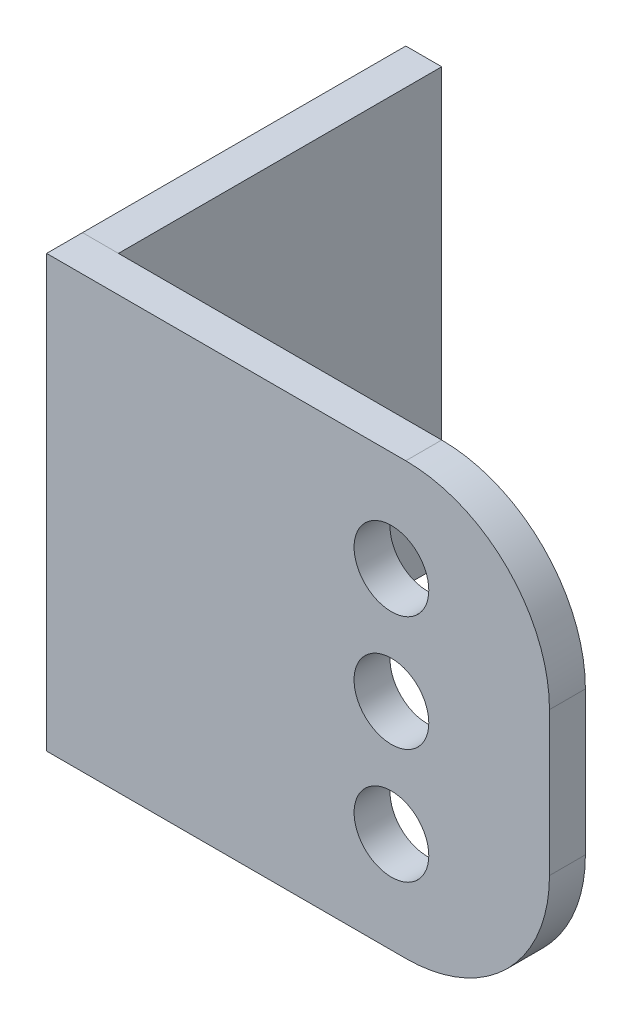
ISO-10303-21;
HEADER;
FILE_DESCRIPTION(('STEP AP214'),'2;1');
FILE_NAME('part.step','',(''),(''),'','','');
FILE_SCHEMA(('AUTOMOTIVE_DESIGN { 1 0 10303 214 1 1 1 1 }'));
ENDSEC;
DATA;
#1=APPLICATION_CONTEXT('core data for automotive mechanical design processes');
#2=APPLICATION_PROTOCOL_DEFINITION('international standard','automotive_design',2000,#1);
#3=PRODUCT_CONTEXT('',#1,'mechanical');
#4=PRODUCT('Part','Part','',(#3));
#5=PRODUCT_RELATED_PRODUCT_CATEGORY('part','',(#4));
#6=PRODUCT_DEFINITION_FORMATION('','',#4);
#7=PRODUCT_DEFINITION_CONTEXT('part definition',#1,'design');
#8=PRODUCT_DEFINITION('design','',#6,#7);
#9=PRODUCT_DEFINITION_SHAPE('','',#8);
#10=(LENGTH_UNIT() NAMED_UNIT(*) SI_UNIT(.MILLI.,.METRE.));
#11=(NAMED_UNIT(*) PLANE_ANGLE_UNIT() SI_UNIT($,.RADIAN.));
#12=(NAMED_UNIT(*) SI_UNIT($,.STERADIAN.) SOLID_ANGLE_UNIT());
#13=UNCERTAINTY_MEASURE_WITH_UNIT(LENGTH_MEASURE(1.E-05),#10,'distance_accuracy_value','');
#14=(GEOMETRIC_REPRESENTATION_CONTEXT(3) GLOBAL_UNCERTAINTY_ASSIGNED_CONTEXT((#13)) GLOBAL_UNIT_ASSIGNED_CONTEXT((#10,
#11,#12)) REPRESENTATION_CONTEXT('',''));
#15=CARTESIAN_POINT('',(0.,0.,0.));
#16=DIRECTION('',(0.,0.,1.));
#17=DIRECTION('',(1.,0.,0.));
#18=AXIS2_PLACEMENT_3D('',#15,#16,#17);
#19=CARTESIAN_POINT('',(0.,19.05,-28.575));
#20=DIRECTION('',(1.,0.,0.));
#21=DIRECTION('',(0.,0.,-1.));
#22=AXIS2_PLACEMENT_3D('',#19,#20,#21);
#23=PLANE('',#22);
#24=DIRECTION('',(0.,1.,0.));
#25=VECTOR('',#24,1.);
#26=CARTESIAN_POINT('',(0.,19.05,0.));
#27=LINE('',#26,#25);
#28=CARTESIAN_POINT('',(0.,-19.05,0.));
#29=VERTEX_POINT('',#28);
#30=CARTESIAN_POINT('',(0.,19.05,0.));
#31=VERTEX_POINT('',#30);
#32=EDGE_CURVE('E114',#29,#31,#27,.T.);
#33=ORIENTED_EDGE('',*,*,#32,.T.);
#34=DIRECTION('',(0.,0.,1.));
#35=VECTOR('',#34,1.);
#36=CARTESIAN_POINT('',(0.,19.05,-28.575));
#37=LINE('',#36,#35);
#38=CARTESIAN_POINT('',(0.,19.05,-28.575));
#39=VERTEX_POINT('',#38);
#40=EDGE_CURVE('E12',#39,#31,#37,.T.);
#41=ORIENTED_EDGE('',*,*,#40,.F.);
#42=DIRECTION('',(0.,1.,0.));
#43=VECTOR('',#42,1.);
#44=CARTESIAN_POINT('',(0.,19.05,-28.575));
#45=LINE('',#44,#43);
#46=CARTESIAN_POINT('',(0.,-19.05,-28.575));
#47=VERTEX_POINT('',#46);
#48=EDGE_CURVE('E102',#47,#39,#45,.T.);
#49=ORIENTED_EDGE('',*,*,#48,.F.);
#50=DIRECTION('',(0.,0.,1.));
#51=VECTOR('',#50,1.);
#52=CARTESIAN_POINT('',(0.,-19.05,-28.575));
#53=LINE('',#52,#51);
#54=EDGE_CURVE('E110',#47,#29,#53,.T.);
#55=ORIENTED_EDGE('',*,*,#54,.T.);
#56=EDGE_LOOP('',(#33,#41,#49,#55));
#57=FACE_BOUND('',#56,.T.);
#58=ADVANCED_FACE('F51',(#57),#23,.F.);
#59=CARTESIAN_POINT('',(0.,19.05,-28.575));
#60=DIRECTION('',(0.,-1.,0.));
#61=DIRECTION('',(0.,0.,-1.));
#62=AXIS2_PLACEMENT_3D('',#59,#60,#61);
#63=PLANE('',#62);
#64=DIRECTION('',(1.,0.,0.));
#65=VECTOR('',#64,1.);
#66=CARTESIAN_POINT('',(0.,19.05,0.));
#67=LINE('',#66,#65);
#68=CARTESIAN_POINT('',(3.17499999999999,19.05,0.));
#69=VERTEX_POINT('',#68);
#70=EDGE_CURVE('E106',#31,#69,#67,.T.);
#71=ORIENTED_EDGE('',*,*,#70,.T.);
#72=DIRECTION('',(0.,0.,1.));
#73=VECTOR('',#72,1.);
#74=CARTESIAN_POINT('',(3.17499999999999,19.05,-28.575));
#75=LINE('',#74,#73);
#76=CARTESIAN_POINT('',(3.17499999999999,19.05,-28.575));
#77=VERTEX_POINT('',#76);
#78=EDGE_CURVE('E59',#77,#69,#75,.T.);
#79=ORIENTED_EDGE('',*,*,#78,.F.);
#80=DIRECTION('',(1.,0.,0.));
#81=VECTOR('',#80,1.);
#82=CARTESIAN_POINT('',(0.,19.05,-28.575));
#83=LINE('',#82,#81);
#84=EDGE_CURVE('E97',#39,#77,#83,.T.);
#85=ORIENTED_EDGE('',*,*,#84,.F.);
#86=ORIENTED_EDGE('',*,*,#40,.T.);
#87=EDGE_LOOP('',(#71,#79,#85,#86));
#88=FACE_BOUND('',#87,.T.);
#89=ADVANCED_FACE('F105',(#88),#63,.F.);
#90=CARTESIAN_POINT('',(3.17499999999999,19.05,-28.575));
#91=DIRECTION('',(-1.,0.,0.));
#92=DIRECTION('',(0.,0.,1.));
#93=AXIS2_PLACEMENT_3D('',#90,#91,#92);
#94=PLANE('',#93);
#95=DIRECTION('',(0.,-1.,0.));
#96=VECTOR('',#95,1.);
#97=CARTESIAN_POINT('',(3.17499999999999,19.05,0.));
#98=LINE('',#97,#96);
#99=CARTESIAN_POINT('',(3.17499999999999,-19.05,0.));
#100=VERTEX_POINT('',#99);
#101=EDGE_CURVE('E84',#69,#100,#98,.T.);
#102=ORIENTED_EDGE('',*,*,#101,.T.);
#103=DIRECTION('',(0.,0.,1.));
#104=VECTOR('',#103,1.);
#105=CARTESIAN_POINT('',(3.17499999999999,-19.05,-28.575));
#106=LINE('',#105,#104);
#107=CARTESIAN_POINT('',(3.17499999999999,-19.05,-28.575));
#108=VERTEX_POINT('',#107);
#109=EDGE_CURVE('E107',#108,#100,#106,.T.);
#110=ORIENTED_EDGE('',*,*,#109,.F.);
#111=DIRECTION('',(0.,-1.,0.));
#112=VECTOR('',#111,1.);
#113=CARTESIAN_POINT('',(3.17499999999999,19.05,-28.575));
#114=LINE('',#113,#112);
#115=EDGE_CURVE('E100',#77,#108,#114,.T.);
#116=ORIENTED_EDGE('',*,*,#115,.F.);
#117=ORIENTED_EDGE('',*,*,#78,.T.);
#118=EDGE_LOOP('',(#102,#110,#116,#117));
#119=FACE_BOUND('',#118,.T.);
#120=ADVANCED_FACE('F108',(#119),#94,.F.);
#121=CARTESIAN_POINT('',(0.,-19.05,-28.575));
#122=DIRECTION('',(0.,1.,0.));
#123=DIRECTION('',(0.,0.,1.));
#124=AXIS2_PLACEMENT_3D('',#121,#122,#123);
#125=PLANE('',#124);
#126=DIRECTION('',(-1.,0.,0.));
#127=VECTOR('',#126,1.);
#128=CARTESIAN_POINT('',(0.,-19.05,0.));
#129=LINE('',#128,#127);
#130=EDGE_CURVE('E90',#100,#29,#129,.T.);
#131=ORIENTED_EDGE('',*,*,#130,.T.);
#132=ORIENTED_EDGE('',*,*,#54,.F.);
#133=DIRECTION('',(-1.,0.,0.));
#134=VECTOR('',#133,1.);
#135=CARTESIAN_POINT('',(0.,-19.05,-28.575));
#136=LINE('',#135,#134);
#137=EDGE_CURVE('E67',#108,#47,#136,.T.);
#138=ORIENTED_EDGE('',*,*,#137,.F.);
#139=ORIENTED_EDGE('',*,*,#109,.T.);
#140=EDGE_LOOP('',(#131,#132,#138,#139));
#141=FACE_BOUND('',#140,.T.);
#142=ADVANCED_FACE('F121',(#141),#125,.F.);
#143=CARTESIAN_POINT('',(0.,0.,-28.575));
#144=DIRECTION('',(0.,0.,1.));
#145=DIRECTION('',(1.,0.,0.));
#146=AXIS2_PLACEMENT_3D('',#143,#144,#145);
#147=PLANE('',#146);
#148=ORIENTED_EDGE('',*,*,#48,.T.);
#149=ORIENTED_EDGE('',*,*,#84,.T.);
#150=ORIENTED_EDGE('',*,*,#115,.T.);
#151=ORIENTED_EDGE('',*,*,#137,.T.);
#152=EDGE_LOOP('',(#148,#149,#150,#151));
#153=FACE_BOUND('',#152,.T.);
#154=ADVANCED_FACE('F98',(#153),#147,.F.);
#155=CARTESIAN_POINT('',(0.,0.,0.));
#156=DIRECTION('',(0.,0.,1.));
#157=DIRECTION('',(1.,0.,0.));
#158=AXIS2_PLACEMENT_3D('',#155,#156,#157);
#159=PLANE('',#158);
#160=ORIENTED_EDGE('',*,*,#32,.F.);
#161=ORIENTED_EDGE('',*,*,#130,.F.);
#162=ORIENTED_EDGE('',*,*,#101,.F.);
#163=ORIENTED_EDGE('',*,*,#70,.F.);
#164=EDGE_LOOP('',(#160,#161,#162,#163));
#165=FACE_BOUND('',#164,.T.);
#166=ADVANCED_FACE('F124',(#165),#159,.T.);
#167=CLOSED_SHELL('',(#58,#89,#120,#142,#154,#166));
#168=MANIFOLD_SOLID_BREP('B2',#167);
#169=CARTESIAN_POINT('',(0.,19.05,3.175));
#170=DIRECTION('',(1.,0.,0.));
#171=DIRECTION('',(0.,0.,-1.));
#172=AXIS2_PLACEMENT_3D('',#169,#170,#171);
#173=PLANE('',#172);
#174=DIRECTION('',(0.,-1.,0.));
#175=VECTOR('',#174,1.);
#176=CARTESIAN_POINT('',(0.,19.05,0.));
#177=LINE('',#176,#175);
#178=CARTESIAN_POINT('',(0.,19.05,0.));
#179=VERTEX_POINT('',#178);
#180=CARTESIAN_POINT('',(0.,-19.05,0.));
#181=VERTEX_POINT('',#180);
#182=EDGE_CURVE('E247',#179,#181,#177,.T.);
#183=ORIENTED_EDGE('',*,*,#182,.T.);
#184=DIRECTION('',(0.,0.,-1.));
#185=VECTOR('',#184,1.);
#186=CARTESIAN_POINT('',(0.,-19.05,3.175));
#187=LINE('',#186,#185);
#188=CARTESIAN_POINT('',(0.,-19.05,3.175));
#189=VERTEX_POINT('',#188);
#190=EDGE_CURVE('E232',#189,#181,#187,.T.);
#191=ORIENTED_EDGE('',*,*,#190,.F.);
#192=DIRECTION('',(0.,-1.,0.));
#193=VECTOR('',#192,1.);
#194=CARTESIAN_POINT('',(0.,19.05,3.175));
#195=LINE('',#194,#193);
#196=CARTESIAN_POINT('',(0.,19.05,3.175));
#197=VERTEX_POINT('',#196);
#198=EDGE_CURVE('E236',#197,#189,#195,.T.);
#199=ORIENTED_EDGE('',*,*,#198,.F.);
#200=DIRECTION('',(0.,0.,-1.));
#201=VECTOR('',#200,1.);
#202=CARTESIAN_POINT('',(0.,19.05,3.175));
#203=LINE('',#202,#201);
#204=EDGE_CURVE('E249',#197,#179,#203,.T.);
#205=ORIENTED_EDGE('',*,*,#204,.T.);
#206=EDGE_LOOP('',(#183,#191,#199,#205));
#207=FACE_BOUND('',#206,.T.);
#208=ADVANCED_FACE('F175',(#207),#173,.F.);
#209=CARTESIAN_POINT('',(0.,-19.05,3.175));
#210=DIRECTION('',(0.,1.,0.));
#211=DIRECTION('',(-1.,0.,0.));
#212=AXIS2_PLACEMENT_3D('',#209,#210,#211);
#213=PLANE('',#212);
#214=DIRECTION('',(1.,0.,0.));
#215=VECTOR('',#214,1.);
#216=CARTESIAN_POINT('',(0.,-19.05,0.));
#217=LINE('',#216,#215);
#218=CARTESIAN_POINT('',(31.75,-19.05,0.));
#219=VERTEX_POINT('',#218);
#220=EDGE_CURVE('E275',#181,#219,#217,.T.);
#221=ORIENTED_EDGE('',*,*,#220,.T.);
#222=DIRECTION('',(0.,0.,-1.));
#223=VECTOR('',#222,1.);
#224=CARTESIAN_POINT('',(31.75,-19.05,3.175));
#225=LINE('',#224,#223);
#226=CARTESIAN_POINT('',(31.75,-19.05,3.175));
#227=VERTEX_POINT('',#226);
#228=EDGE_CURVE('E198',#219,#227,#225,.F.);
#229=ORIENTED_EDGE('',*,*,#228,.T.);
#230=DIRECTION('',(1.,0.,0.));
#231=VECTOR('',#230,1.);
#232=CARTESIAN_POINT('',(0.,-19.05,3.175));
#233=LINE('',#232,#231);
#234=EDGE_CURVE('E228',#189,#227,#233,.T.);
#235=ORIENTED_EDGE('',*,*,#234,.F.);
#236=ORIENTED_EDGE('',*,*,#190,.T.);
#237=EDGE_LOOP('',(#221,#229,#235,#236));
#238=FACE_BOUND('',#237,.T.);
#239=ADVANCED_FACE('F230',(#238),#213,.F.);
#240=CARTESIAN_POINT('',(44.45,19.05,3.175));
#241=DIRECTION('',(-1.,0.,0.));
#242=DIRECTION('',(0.,0.,1.));
#243=AXIS2_PLACEMENT_3D('',#240,#241,#242);
#244=PLANE('',#243);
#245=DIRECTION('',(0.,1.,0.));
#246=VECTOR('',#245,1.);
#247=CARTESIAN_POINT('',(44.45,19.05,3.175));
#248=LINE('',#247,#246);
#249=CARTESIAN_POINT('',(44.45,-6.34999999999999,3.175));
#250=VERTEX_POINT('',#249);
#251=CARTESIAN_POINT('',(44.45,6.35,3.175));
#252=VERTEX_POINT('',#251);
#253=EDGE_CURVE('E235',#250,#252,#248,.T.);
#254=ORIENTED_EDGE('',*,*,#253,.F.);
#255=DIRECTION('',(0.,0.,-1.));
#256=VECTOR('',#255,1.);
#257=CARTESIAN_POINT('',(44.45,-6.35,3.175));
#258=LINE('',#257,#256);
#259=CARTESIAN_POINT('',(44.45,-6.34999999999999,0.));
#260=VERTEX_POINT('',#259);
#261=EDGE_CURVE('E251',#250,#260,#258,.T.);
#262=ORIENTED_EDGE('',*,*,#261,.T.);
#263=DIRECTION('',(0.,1.,0.));
#264=VECTOR('',#263,1.);
#265=CARTESIAN_POINT('',(44.45,19.05,0.));
#266=LINE('',#265,#264);
#267=CARTESIAN_POINT('',(44.45,6.35,0.));
#268=VERTEX_POINT('',#267);
#269=EDGE_CURVE('E276',#260,#268,#266,.T.);
#270=ORIENTED_EDGE('',*,*,#269,.T.);
#271=DIRECTION('',(0.,0.,-1.));
#272=VECTOR('',#271,1.);
#273=CARTESIAN_POINT('',(44.45,6.35,3.175));
#274=LINE('',#273,#272);
#275=EDGE_CURVE('E248',#268,#252,#274,.F.);
#276=ORIENTED_EDGE('',*,*,#275,.T.);
#277=EDGE_LOOP('',(#254,#262,#270,#276));
#278=FACE_BOUND('',#277,.T.);
#279=ADVANCED_FACE('F267',(#278),#244,.F.);
#280=CARTESIAN_POINT('',(0.,19.05,3.175));
#281=DIRECTION('',(0.,-1.,0.));
#282=DIRECTION('',(1.,0.,0.));
#283=AXIS2_PLACEMENT_3D('',#280,#281,#282);
#284=PLANE('',#283);
#285=DIRECTION('',(-1.,0.,0.));
#286=VECTOR('',#285,1.);
#287=CARTESIAN_POINT('',(0.,19.05,3.175));
#288=LINE('',#287,#286);
#289=CARTESIAN_POINT('',(31.75,19.05,3.175));
#290=VERTEX_POINT('',#289);
#291=EDGE_CURVE('E240',#290,#197,#288,.T.);
#292=ORIENTED_EDGE('',*,*,#291,.F.);
#293=DIRECTION('',(0.,0.,-1.));
#294=VECTOR('',#293,1.);
#295=CARTESIAN_POINT('',(31.75,19.05,3.175));
#296=LINE('',#295,#294);
#297=CARTESIAN_POINT('',(31.75,19.05,0.));
#298=VERTEX_POINT('',#297);
#299=EDGE_CURVE('E49',#290,#298,#296,.T.);
#300=ORIENTED_EDGE('',*,*,#299,.T.);
#301=DIRECTION('',(-1.,0.,0.));
#302=VECTOR('',#301,1.);
#303=CARTESIAN_POINT('',(0.,19.05,0.));
#304=LINE('',#303,#302);
#305=EDGE_CURVE('E244',#298,#179,#304,.T.);
#306=ORIENTED_EDGE('',*,*,#305,.T.);
#307=ORIENTED_EDGE('',*,*,#204,.F.);
#308=EDGE_LOOP('',(#292,#300,#306,#307));
#309=FACE_BOUND('',#308,.T.);
#310=ADVANCED_FACE('F284',(#309),#284,.F.);
#311=CARTESIAN_POINT('',(0.,0.,3.175));
#312=DIRECTION('',(0.,0.,1.));
#313=DIRECTION('',(1.,0.,0.));
#314=AXIS2_PLACEMENT_3D('',#311,#312,#313);
#315=PLANE('',#314);
#316=CARTESIAN_POINT('',(30.48,10.16,3.175));
#317=DIRECTION('',(0.,0.,1.));
#318=DIRECTION('',(1.,0.,0.));
#319=AXIS2_PLACEMENT_3D('',#316,#317,#318);
#320=CIRCLE('',#319,3.30199999999998);
#321=CARTESIAN_POINT('',(33.782,10.16,3.175));
#322=VERTEX_POINT('',#321);
#323=EDGE_CURVE('E279',#322,#322,#320,.T.);
#324=ORIENTED_EDGE('',*,*,#323,.F.);
#325=EDGE_LOOP('',(#324));
#326=FACE_BOUND('',#325,.T.);
#327=CARTESIAN_POINT('',(30.48,-10.16,3.175));
#328=DIRECTION('',(0.,0.,1.));
#329=DIRECTION('',(1.,0.,0.));
#330=AXIS2_PLACEMENT_3D('',#327,#328,#329);
#331=CIRCLE('',#330,3.30199999999998);
#332=CARTESIAN_POINT('',(33.782,-10.16,3.175));
#333=VERTEX_POINT('',#332);
#334=EDGE_CURVE('E331',#333,#333,#331,.T.);
#335=ORIENTED_EDGE('',*,*,#334,.F.);
#336=EDGE_LOOP('',(#335));
#337=FACE_BOUND('',#336,.T.);
#338=CARTESIAN_POINT('',(30.48,0.,3.175));
#339=DIRECTION('',(0.,0.,1.));
#340=DIRECTION('',(1.,0.,0.));
#341=AXIS2_PLACEMENT_3D('',#338,#339,#340);
#342=CIRCLE('',#341,3.302);
#343=CARTESIAN_POINT('',(33.782,0.,3.175));
#344=VERTEX_POINT('',#343);
#345=EDGE_CURVE('E327',#344,#344,#342,.T.);
#346=ORIENTED_EDGE('',*,*,#345,.F.);
#347=EDGE_LOOP('',(#346));
#348=FACE_BOUND('',#347,.T.);
#349=ORIENTED_EDGE('',*,*,#234,.T.);
#350=CARTESIAN_POINT('',(31.75,-6.35,3.175));
#351=DIRECTION('',(0.,0.,1.));
#352=DIRECTION('',(1.,0.,0.));
#353=AXIS2_PLACEMENT_3D('',#350,#351,#352);
#354=CIRCLE('',#353,12.7);
#355=EDGE_CURVE('E183',#227,#250,#354,.T.);
#356=ORIENTED_EDGE('',*,*,#355,.T.);
#357=ORIENTED_EDGE('',*,*,#253,.T.);
#358=CARTESIAN_POINT('',(31.75,6.35,3.175));
#359=DIRECTION('',(0.,0.,1.));
#360=DIRECTION('',(1.,0.,0.));
#361=AXIS2_PLACEMENT_3D('',#358,#359,#360);
#362=CIRCLE('',#361,12.7);
#363=EDGE_CURVE('E190',#252,#290,#362,.T.);
#364=ORIENTED_EDGE('',*,*,#363,.T.);
#365=ORIENTED_EDGE('',*,*,#291,.T.);
#366=ORIENTED_EDGE('',*,*,#198,.T.);
#367=EDGE_LOOP('',(#349,#356,#357,#364,#365,#366));
#368=FACE_BOUND('',#367,.T.);
#369=ADVANCED_FACE('F239',(#326,#337,#348,#368),#315,.T.);
#370=CARTESIAN_POINT('',(0.,0.,0.));
#371=DIRECTION('',(0.,0.,1.));
#372=DIRECTION('',(1.,0.,0.));
#373=AXIS2_PLACEMENT_3D('',#370,#371,#372);
#374=PLANE('',#373);
#375=CARTESIAN_POINT('',(30.48,10.16,0.));
#376=DIRECTION('',(0.,0.,1.));
#377=DIRECTION('',(1.,0.,0.));
#378=AXIS2_PLACEMENT_3D('',#375,#376,#377);
#379=CIRCLE('',#378,3.30199999999998);
#380=CARTESIAN_POINT('',(33.782,10.16,0.));
#381=VERTEX_POINT('',#380);
#382=EDGE_CURVE('E326',#381,#381,#379,.T.);
#383=ORIENTED_EDGE('',*,*,#382,.T.);
#384=EDGE_LOOP('',(#383));
#385=FACE_BOUND('',#384,.T.);
#386=CARTESIAN_POINT('',(30.48,-10.16,0.));
#387=DIRECTION('',(0.,0.,1.));
#388=DIRECTION('',(1.,0.,0.));
#389=AXIS2_PLACEMENT_3D('',#386,#387,#388);
#390=CIRCLE('',#389,3.30199999999998);
#391=CARTESIAN_POINT('',(33.782,-10.16,0.));
#392=VERTEX_POINT('',#391);
#393=EDGE_CURVE('E328',#392,#392,#390,.T.);
#394=ORIENTED_EDGE('',*,*,#393,.T.);
#395=EDGE_LOOP('',(#394));
#396=FACE_BOUND('',#395,.T.);
#397=CARTESIAN_POINT('',(30.48,0.,0.));
#398=DIRECTION('',(0.,0.,1.));
#399=DIRECTION('',(1.,0.,0.));
#400=AXIS2_PLACEMENT_3D('',#397,#398,#399);
#401=CIRCLE('',#400,3.302);
#402=CARTESIAN_POINT('',(33.782,0.,0.));
#403=VERTEX_POINT('',#402);
#404=EDGE_CURVE('E334',#403,#403,#401,.T.);
#405=ORIENTED_EDGE('',*,*,#404,.T.);
#406=EDGE_LOOP('',(#405));
#407=FACE_BOUND('',#406,.T.);
#408=ORIENTED_EDGE('',*,*,#269,.F.);
#409=CARTESIAN_POINT('',(31.75,-6.35,0.));
#410=DIRECTION('',(0.,0.,1.));
#411=DIRECTION('',(1.,0.,0.));
#412=AXIS2_PLACEMENT_3D('',#409,#410,#411);
#413=CIRCLE('',#412,12.7);
#414=EDGE_CURVE('E260',#260,#219,#413,.F.);
#415=ORIENTED_EDGE('',*,*,#414,.T.);
#416=ORIENTED_EDGE('',*,*,#220,.F.);
#417=ORIENTED_EDGE('',*,*,#182,.F.);
#418=ORIENTED_EDGE('',*,*,#305,.F.);
#419=CARTESIAN_POINT('',(31.75,6.35,0.));
#420=DIRECTION('',(0.,0.,1.));
#421=DIRECTION('',(1.,0.,0.));
#422=AXIS2_PLACEMENT_3D('',#419,#420,#421);
#423=CIRCLE('',#422,12.7);
#424=EDGE_CURVE('E258',#298,#268,#423,.F.);
#425=ORIENTED_EDGE('',*,*,#424,.T.);
#426=EDGE_LOOP('',(#408,#415,#416,#417,#418,#425));
#427=FACE_BOUND('',#426,.T.);
#428=ADVANCED_FACE('F274',(#385,#396,#407,#427),#374,.F.);
#429=CARTESIAN_POINT('',(30.48,0.,0.));
#430=DIRECTION('',(0.,0.,1.));
#431=DIRECTION('',(1.,0.,0.));
#432=AXIS2_PLACEMENT_3D('',#429,#430,#431);
#433=CYLINDRICAL_SURFACE('',#432,3.302);
#434=ORIENTED_EDGE('',*,*,#345,.T.);
#435=EDGE_LOOP('',(#434));
#436=FACE_BOUND('',#435,.T.);
#437=ORIENTED_EDGE('',*,*,#404,.F.);
#438=EDGE_LOOP('',(#437));
#439=FACE_BOUND('',#438,.T.);
#440=ADVANCED_FACE('F306',(#436,#439),#433,.F.);
#441=CARTESIAN_POINT('',(30.48,-10.16,0.));
#442=DIRECTION('',(0.,0.,1.));
#443=DIRECTION('',(1.,0.,0.));
#444=AXIS2_PLACEMENT_3D('',#441,#442,#443);
#445=CYLINDRICAL_SURFACE('',#444,3.30199999999998);
#446=ORIENTED_EDGE('',*,*,#334,.T.);
#447=EDGE_LOOP('',(#446));
#448=FACE_BOUND('',#447,.T.);
#449=ORIENTED_EDGE('',*,*,#393,.F.);
#450=EDGE_LOOP('',(#449));
#451=FACE_BOUND('',#450,.T.);
#452=ADVANCED_FACE('F312',(#448,#451),#445,.F.);
#453=CARTESIAN_POINT('',(30.48,10.16,0.));
#454=DIRECTION('',(0.,0.,1.));
#455=DIRECTION('',(1.,0.,0.));
#456=AXIS2_PLACEMENT_3D('',#453,#454,#455);
#457=CYLINDRICAL_SURFACE('',#456,3.30199999999998);
#458=ORIENTED_EDGE('',*,*,#323,.T.);
#459=EDGE_LOOP('',(#458));
#460=FACE_BOUND('',#459,.T.);
#461=ORIENTED_EDGE('',*,*,#382,.F.);
#462=EDGE_LOOP('',(#461));
#463=FACE_BOUND('',#462,.T.);
#464=ADVANCED_FACE('F291',(#460,#463),#457,.F.);
#465=CARTESIAN_POINT('',(31.75,-6.35,3.175));
#466=DIRECTION('',(0.,0.,-1.));
#467=DIRECTION('',(-1.,0.,0.));
#468=AXIS2_PLACEMENT_3D('',#465,#466,#467);
#469=CYLINDRICAL_SURFACE('',#468,12.7);
#470=ORIENTED_EDGE('',*,*,#355,.F.);
#471=ORIENTED_EDGE('',*,*,#228,.F.);
#472=ORIENTED_EDGE('',*,*,#414,.F.);
#473=ORIENTED_EDGE('',*,*,#261,.F.);
#474=EDGE_LOOP('',(#470,#471,#472,#473));
#475=FACE_BOUND('',#474,.T.);
#476=ADVANCED_FACE('F272',(#475),#469,.T.);
#477=CARTESIAN_POINT('',(31.75,6.35,3.175));
#478=DIRECTION('',(0.,0.,-1.));
#479=DIRECTION('',(-1.,0.,0.));
#480=AXIS2_PLACEMENT_3D('',#477,#478,#479);
#481=CYLINDRICAL_SURFACE('',#480,12.7);
#482=ORIENTED_EDGE('',*,*,#363,.F.);
#483=ORIENTED_EDGE('',*,*,#275,.F.);
#484=ORIENTED_EDGE('',*,*,#424,.F.);
#485=ORIENTED_EDGE('',*,*,#299,.F.);
#486=EDGE_LOOP('',(#482,#483,#484,#485));
#487=FACE_BOUND('',#486,.T.);
#488=ADVANCED_FACE('F177',(#487),#481,.T.);
#489=CLOSED_SHELL('',(#208,#239,#279,#310,#369,#428,#440,#452,#464,#476,#488));
#490=MANIFOLD_SOLID_BREP('B6',#489);
#491=ADVANCED_BREP_SHAPE_REPRESENTATION('',(#18,#168,#490),#14);
#492=SHAPE_DEFINITION_REPRESENTATION(#9,#491);
ENDSEC;
END-ISO-10303-21;
